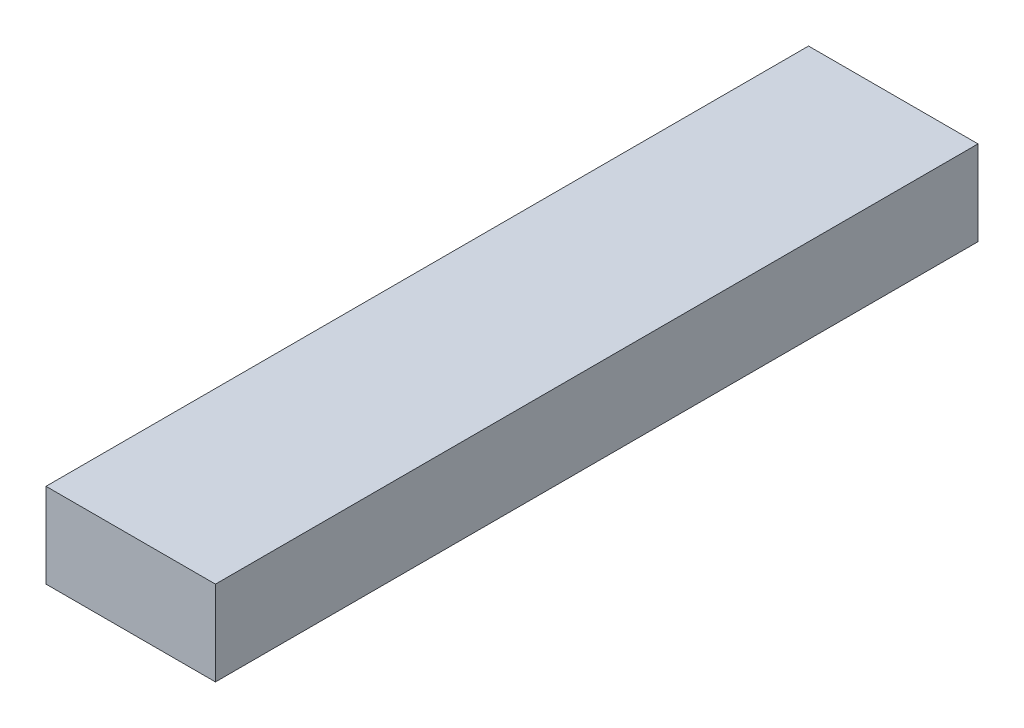
ISO-10303-21;
HEADER;
FILE_DESCRIPTION(('STEP AP214'),'2;1');
FILE_NAME('part.step','',(''),(''),'','','');
FILE_SCHEMA(('AUTOMOTIVE_DESIGN { 1 0 10303 214 1 1 1 1 }'));
ENDSEC;
DATA;
#1=APPLICATION_CONTEXT('core data for automotive mechanical design processes');
#2=APPLICATION_PROTOCOL_DEFINITION('international standard','automotive_design',2000,#1);
#3=PRODUCT_CONTEXT('',#1,'mechanical');
#4=PRODUCT('Part','Part','',(#3));
#5=PRODUCT_RELATED_PRODUCT_CATEGORY('part','',(#4));
#6=PRODUCT_DEFINITION_FORMATION('','',#4);
#7=PRODUCT_DEFINITION_CONTEXT('part definition',#1,'design');
#8=PRODUCT_DEFINITION('design','',#6,#7);
#9=PRODUCT_DEFINITION_SHAPE('','',#8);
#10=(LENGTH_UNIT() NAMED_UNIT(*) SI_UNIT(.MILLI.,.METRE.));
#11=(NAMED_UNIT(*) PLANE_ANGLE_UNIT() SI_UNIT($,.RADIAN.));
#12=(NAMED_UNIT(*) SI_UNIT($,.STERADIAN.) SOLID_ANGLE_UNIT());
#13=UNCERTAINTY_MEASURE_WITH_UNIT(LENGTH_MEASURE(1.E-05),#10,'distance_accuracy_value','');
#14=(GEOMETRIC_REPRESENTATION_CONTEXT(3) GLOBAL_UNCERTAINTY_ASSIGNED_CONTEXT((#13)) GLOBAL_UNIT_ASSIGNED_CONTEXT((#10,
#11,#12)) REPRESENTATION_CONTEXT('',''));
#15=CARTESIAN_POINT('',(0.,0.,0.));
#16=DIRECTION('',(0.,0.,1.));
#17=DIRECTION('',(1.,0.,0.));
#18=AXIS2_PLACEMENT_3D('',#15,#16,#17);
#19=CARTESIAN_POINT('',(25.4,-12.7,228.6));
#20=DIRECTION('',(-1.,0.,0.));
#21=DIRECTION('',(0.,0.,1.));
#22=AXIS2_PLACEMENT_3D('',#19,#20,#21);
#23=PLANE('',#22);
#24=DIRECTION('',(0.,1.,0.));
#25=VECTOR('',#24,1.);
#26=CARTESIAN_POINT('',(25.4,-12.7,0.));
#27=LINE('',#26,#25);
#28=CARTESIAN_POINT('',(25.4,-12.7,0.));
#29=VERTEX_POINT('',#28);
#30=CARTESIAN_POINT('',(25.4,12.7,0.));
#31=VERTEX_POINT('',#30);
#32=EDGE_CURVE('E106',#29,#31,#27,.T.);
#33=ORIENTED_EDGE('',*,*,#32,.T.);
#34=DIRECTION('',(0.,0.,-1.));
#35=VECTOR('',#34,1.);
#36=CARTESIAN_POINT('',(25.4,12.7,228.6));
#37=LINE('',#36,#35);
#38=CARTESIAN_POINT('',(25.4,12.7,228.6));
#39=VERTEX_POINT('',#38);
#40=EDGE_CURVE('E11',#39,#31,#37,.T.);
#41=ORIENTED_EDGE('',*,*,#40,.F.);
#42=DIRECTION('',(0.,1.,0.));
#43=VECTOR('',#42,1.);
#44=CARTESIAN_POINT('',(25.4,-12.7,228.6));
#45=LINE('',#44,#43);
#46=CARTESIAN_POINT('',(25.4,-12.7,228.6));
#47=VERTEX_POINT('',#46);
#48=EDGE_CURVE('E94',#47,#39,#45,.T.);
#49=ORIENTED_EDGE('',*,*,#48,.F.);
#50=DIRECTION('',(0.,0.,-1.));
#51=VECTOR('',#50,1.);
#52=CARTESIAN_POINT('',(25.4,-12.7,228.6));
#53=LINE('',#52,#51);
#54=EDGE_CURVE('E102',#47,#29,#53,.T.);
#55=ORIENTED_EDGE('',*,*,#54,.T.);
#56=EDGE_LOOP('',(#33,#41,#49,#55));
#57=FACE_BOUND('',#56,.T.);
#58=ADVANCED_FACE('F43',(#57),#23,.F.);
#59=CARTESIAN_POINT('',(-25.4,12.7,228.6));
#60=DIRECTION('',(0.,-1.,0.));
#61=DIRECTION('',(0.,0.,-1.));
#62=AXIS2_PLACEMENT_3D('',#59,#60,#61);
#63=PLANE('',#62);
#64=DIRECTION('',(-1.,0.,0.));
#65=VECTOR('',#64,1.);
#66=CARTESIAN_POINT('',(-25.4,12.7,0.));
#67=LINE('',#66,#65);
#68=CARTESIAN_POINT('',(-25.4,12.7,0.));
#69=VERTEX_POINT('',#68);
#70=EDGE_CURVE('E98',#31,#69,#67,.T.);
#71=ORIENTED_EDGE('',*,*,#70,.T.);
#72=DIRECTION('',(0.,0.,-1.));
#73=VECTOR('',#72,1.);
#74=CARTESIAN_POINT('',(-25.4,12.7,228.6));
#75=LINE('',#74,#73);
#76=CARTESIAN_POINT('',(-25.4,12.7,228.6));
#77=VERTEX_POINT('',#76);
#78=EDGE_CURVE('E51',#77,#69,#75,.T.);
#79=ORIENTED_EDGE('',*,*,#78,.F.);
#80=DIRECTION('',(-1.,0.,0.));
#81=VECTOR('',#80,1.);
#82=CARTESIAN_POINT('',(-25.4,12.7,228.6));
#83=LINE('',#82,#81);
#84=EDGE_CURVE('E89',#39,#77,#83,.T.);
#85=ORIENTED_EDGE('',*,*,#84,.F.);
#86=ORIENTED_EDGE('',*,*,#40,.T.);
#87=EDGE_LOOP('',(#71,#79,#85,#86));
#88=FACE_BOUND('',#87,.T.);
#89=ADVANCED_FACE('F97',(#88),#63,.F.);
#90=CARTESIAN_POINT('',(-25.4,-12.7,228.6));
#91=DIRECTION('',(1.,0.,0.));
#92=DIRECTION('',(0.,0.,-1.));
#93=AXIS2_PLACEMENT_3D('',#90,#91,#92);
#94=PLANE('',#93);
#95=DIRECTION('',(0.,-1.,0.));
#96=VECTOR('',#95,1.);
#97=CARTESIAN_POINT('',(-25.4,-12.7,0.));
#98=LINE('',#97,#96);
#99=CARTESIAN_POINT('',(-25.4,-12.7,0.));
#100=VERTEX_POINT('',#99);
#101=EDGE_CURVE('E76',#69,#100,#98,.T.);
#102=ORIENTED_EDGE('',*,*,#101,.T.);
#103=DIRECTION('',(0.,0.,-1.));
#104=VECTOR('',#103,1.);
#105=CARTESIAN_POINT('',(-25.4,-12.7,228.6));
#106=LINE('',#105,#104);
#107=CARTESIAN_POINT('',(-25.4,-12.7,228.6));
#108=VERTEX_POINT('',#107);
#109=EDGE_CURVE('E99',#108,#100,#106,.T.);
#110=ORIENTED_EDGE('',*,*,#109,.F.);
#111=DIRECTION('',(0.,-1.,0.));
#112=VECTOR('',#111,1.);
#113=CARTESIAN_POINT('',(-25.4,-12.7,228.6));
#114=LINE('',#113,#112);
#115=EDGE_CURVE('E92',#77,#108,#114,.T.);
#116=ORIENTED_EDGE('',*,*,#115,.F.);
#117=ORIENTED_EDGE('',*,*,#78,.T.);
#118=EDGE_LOOP('',(#102,#110,#116,#117));
#119=FACE_BOUND('',#118,.T.);
#120=ADVANCED_FACE('F100',(#119),#94,.F.);
#121=CARTESIAN_POINT('',(-25.4,-12.7,228.6));
#122=DIRECTION('',(0.,1.,0.));
#123=DIRECTION('',(0.,0.,1.));
#124=AXIS2_PLACEMENT_3D('',#121,#122,#123);
#125=PLANE('',#124);
#126=DIRECTION('',(1.,0.,0.));
#127=VECTOR('',#126,1.);
#128=CARTESIAN_POINT('',(-25.4,-12.7,0.));
#129=LINE('',#128,#127);
#130=EDGE_CURVE('E82',#100,#29,#129,.T.);
#131=ORIENTED_EDGE('',*,*,#130,.T.);
#132=ORIENTED_EDGE('',*,*,#54,.F.);
#133=DIRECTION('',(1.,0.,0.));
#134=VECTOR('',#133,1.);
#135=CARTESIAN_POINT('',(-25.4,-12.7,228.6));
#136=LINE('',#135,#134);
#137=EDGE_CURVE('E59',#108,#47,#136,.T.);
#138=ORIENTED_EDGE('',*,*,#137,.F.);
#139=ORIENTED_EDGE('',*,*,#109,.T.);
#140=EDGE_LOOP('',(#131,#132,#138,#139));
#141=FACE_BOUND('',#140,.T.);
#142=ADVANCED_FACE('F113',(#141),#125,.F.);
#143=CARTESIAN_POINT('',(0.,0.,228.6));
#144=DIRECTION('',(0.,0.,-1.));
#145=DIRECTION('',(-1.,0.,0.));
#146=AXIS2_PLACEMENT_3D('',#143,#144,#145);
#147=PLANE('',#146);
#148=ORIENTED_EDGE('',*,*,#48,.T.);
#149=ORIENTED_EDGE('',*,*,#84,.T.);
#150=ORIENTED_EDGE('',*,*,#115,.T.);
#151=ORIENTED_EDGE('',*,*,#137,.T.);
#152=EDGE_LOOP('',(#148,#149,#150,#151));
#153=FACE_BOUND('',#152,.T.);
#154=ADVANCED_FACE('F90',(#153),#147,.F.);
#155=CARTESIAN_POINT('',(0.,0.,0.));
#156=DIRECTION('',(0.,0.,-1.));
#157=DIRECTION('',(-1.,0.,0.));
#158=AXIS2_PLACEMENT_3D('',#155,#156,#157);
#159=PLANE('',#158);
#160=ORIENTED_EDGE('',*,*,#32,.F.);
#161=ORIENTED_EDGE('',*,*,#130,.F.);
#162=ORIENTED_EDGE('',*,*,#101,.F.);
#163=ORIENTED_EDGE('',*,*,#70,.F.);
#164=EDGE_LOOP('',(#160,#161,#162,#163));
#165=FACE_BOUND('',#164,.T.);
#166=ADVANCED_FACE('F116',(#165),#159,.T.);
#167=CLOSED_SHELL('',(#58,#89,#120,#142,#154,#166));
#168=MANIFOLD_SOLID_BREP('B2',#167);
#169=ADVANCED_BREP_SHAPE_REPRESENTATION('',(#18,#168),#14);
#170=SHAPE_DEFINITION_REPRESENTATION(#9,#169);
ENDSEC;
END-ISO-10303-21;
